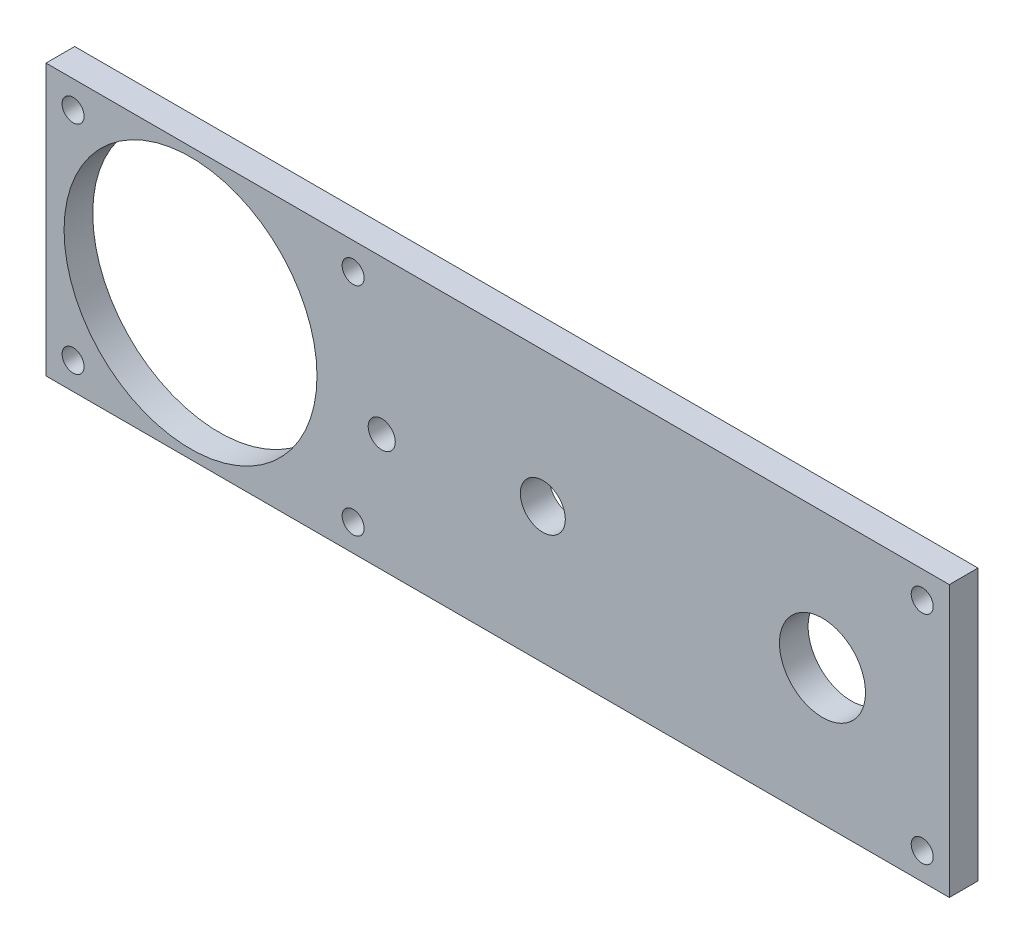
ISO-10303-21;
HEADER;
FILE_DESCRIPTION(('STEP AP214'),'2;1');
FILE_NAME('part.step','',(''),(''),'','','');
FILE_SCHEMA(('AUTOMOTIVE_DESIGN { 1 0 10303 214 1 1 1 1 }'));
ENDSEC;
DATA;
#1=APPLICATION_CONTEXT('core data for automotive mechanical design processes');
#2=APPLICATION_PROTOCOL_DEFINITION('international standard','automotive_design',2000,#1);
#3=PRODUCT_CONTEXT('',#1,'mechanical');
#4=PRODUCT('Part','Part','',(#3));
#5=PRODUCT_RELATED_PRODUCT_CATEGORY('part','',(#4));
#6=PRODUCT_DEFINITION_FORMATION('','',#4);
#7=PRODUCT_DEFINITION_CONTEXT('part definition',#1,'design');
#8=PRODUCT_DEFINITION('design','',#6,#7);
#9=PRODUCT_DEFINITION_SHAPE('','',#8);
#10=(LENGTH_UNIT() NAMED_UNIT(*) SI_UNIT(.MILLI.,.METRE.));
#11=(NAMED_UNIT(*) PLANE_ANGLE_UNIT() SI_UNIT($,.RADIAN.));
#12=(NAMED_UNIT(*) SI_UNIT($,.STERADIAN.) SOLID_ANGLE_UNIT());
#13=UNCERTAINTY_MEASURE_WITH_UNIT(LENGTH_MEASURE(1.E-05),#10,'distance_accuracy_value','');
#14=(GEOMETRIC_REPRESENTATION_CONTEXT(3) GLOBAL_UNCERTAINTY_ASSIGNED_CONTEXT((#13)) GLOBAL_UNIT_ASSIGNED_CONTEXT((#10,
#11,#12)) REPRESENTATION_CONTEXT('',''));
#15=CARTESIAN_POINT('',(0.,0.,0.));
#16=DIRECTION('',(0.,0.,1.));
#17=DIRECTION('',(1.,0.,0.));
#18=AXIS2_PLACEMENT_3D('',#15,#16,#17);
#19=CARTESIAN_POINT('',(0.,0.,3.175));
#20=DIRECTION('',(0.,0.,-1.));
#21=DIRECTION('',(-1.,0.,0.));
#22=AXIS2_PLACEMENT_3D('',#19,#20,#21);
#23=PLANE('',#22);
#24=CARTESIAN_POINT('',(85.9562,15.,3.175));
#25=DIRECTION('',(0.,0.,1.));
#26=DIRECTION('',(1.,0.,0.));
#27=AXIS2_PLACEMENT_3D('',#24,#25,#26);
#28=CIRCLE('',#27,4.7625);
#29=CARTESIAN_POINT('',(90.7187,15.,3.175));
#30=VERTEX_POINT('',#29);
#31=EDGE_CURVE('E165',#30,#30,#28,.T.);
#32=ORIENTED_EDGE('',*,*,#31,.F.);
#33=EDGE_LOOP('',(#32));
#34=FACE_BOUND('',#33,.T.);
#35=CARTESIAN_POINT('',(97.,3.,3.175));
#36=DIRECTION('',(0.,0.,1.));
#37=DIRECTION('',(1.,0.,0.));
#38=AXIS2_PLACEMENT_3D('',#35,#36,#37);
#39=CIRCLE('',#38,1.2192);
#40=CARTESIAN_POINT('',(98.2192,3.,3.175));
#41=VERTEX_POINT('',#40);
#42=EDGE_CURVE('E161',#41,#41,#39,.T.);
#43=ORIENTED_EDGE('',*,*,#42,.F.);
#44=EDGE_LOOP('',(#43));
#45=FACE_BOUND('',#44,.T.);
#46=CARTESIAN_POINT('',(97.,27.,3.175));
#47=DIRECTION('',(0.,0.,1.));
#48=DIRECTION('',(1.,0.,0.));
#49=AXIS2_PLACEMENT_3D('',#46,#47,#48);
#50=CIRCLE('',#49,1.2192);
#51=CARTESIAN_POINT('',(98.2192,27.,3.175));
#52=VERTEX_POINT('',#51);
#53=EDGE_CURVE('E155',#52,#52,#50,.T.);
#54=ORIENTED_EDGE('',*,*,#53,.F.);
#55=EDGE_LOOP('',(#54));
#56=FACE_BOUND('',#55,.T.);
#57=CARTESIAN_POINT('',(3.,27.,3.175));
#58=DIRECTION('',(0.,0.,1.));
#59=DIRECTION('',(1.,0.,0.));
#60=AXIS2_PLACEMENT_3D('',#57,#58,#59);
#61=CIRCLE('',#60,1.2192);
#62=CARTESIAN_POINT('',(4.2192,27.,3.175));
#63=VERTEX_POINT('',#62);
#64=EDGE_CURVE('E149',#63,#63,#61,.T.);
#65=ORIENTED_EDGE('',*,*,#64,.F.);
#66=EDGE_LOOP('',(#65));
#67=FACE_BOUND('',#66,.T.);
#68=CARTESIAN_POINT('',(3.,3.,3.175));
#69=DIRECTION('',(0.,0.,1.));
#70=DIRECTION('',(1.,0.,0.));
#71=AXIS2_PLACEMENT_3D('',#68,#69,#70);
#72=CIRCLE('',#71,1.2192);
#73=CARTESIAN_POINT('',(4.2192,3.,3.175));
#74=VERTEX_POINT('',#73);
#75=EDGE_CURVE('E143',#74,#74,#72,.T.);
#76=ORIENTED_EDGE('',*,*,#75,.F.);
#77=EDGE_LOOP('',(#76));
#78=FACE_BOUND('',#77,.T.);
#79=CARTESIAN_POINT('',(34.,27.,3.175));
#80=DIRECTION('',(0.,0.,1.));
#81=DIRECTION('',(1.,0.,0.));
#82=AXIS2_PLACEMENT_3D('',#79,#80,#81);
#83=CIRCLE('',#82,1.2192);
#84=CARTESIAN_POINT('',(35.2192,27.,3.175));
#85=VERTEX_POINT('',#84);
#86=EDGE_CURVE('E137',#85,#85,#83,.T.);
#87=ORIENTED_EDGE('',*,*,#86,.F.);
#88=EDGE_LOOP('',(#87));
#89=FACE_BOUND('',#88,.T.);
#90=CARTESIAN_POINT('',(34.,3.,3.175));
#91=DIRECTION('',(0.,0.,1.));
#92=DIRECTION('',(1.,0.,0.));
#93=AXIS2_PLACEMENT_3D('',#90,#91,#92);
#94=CIRCLE('',#93,1.2192);
#95=CARTESIAN_POINT('',(35.2192,3.,3.175));
#96=VERTEX_POINT('',#95);
#97=EDGE_CURVE('E131',#96,#96,#94,.T.);
#98=ORIENTED_EDGE('',*,*,#97,.F.);
#99=EDGE_LOOP('',(#98));
#100=FACE_BOUND('',#99,.T.);
#101=CARTESIAN_POINT('',(37.1666992956996,13.,3.175));
#102=DIRECTION('',(0.,0.,1.));
#103=DIRECTION('',(1.,0.,0.));
#104=AXIS2_PLACEMENT_3D('',#101,#102,#103);
#105=CIRCLE('',#104,1.49860000000001);
#106=CARTESIAN_POINT('',(38.6652992956997,13.,3.175));
#107=VERTEX_POINT('',#106);
#108=EDGE_CURVE('E114',#107,#107,#105,.T.);
#109=ORIENTED_EDGE('',*,*,#108,.F.);
#110=EDGE_LOOP('',(#109));
#111=FACE_BOUND('',#110,.T.);
#112=DIRECTION('',(0.,-1.,0.));
#113=VECTOR('',#112,1.);
#114=CARTESIAN_POINT('',(0.,0.,3.175));
#115=LINE('',#114,#113);
#116=CARTESIAN_POINT('',(0.,30.,3.175));
#117=VERTEX_POINT('',#116);
#118=CARTESIAN_POINT('',(0.,0.,3.175));
#119=VERTEX_POINT('',#118);
#120=EDGE_CURVE('E84',#117,#119,#115,.T.);
#121=ORIENTED_EDGE('',*,*,#120,.T.);
#122=DIRECTION('',(1.,0.,0.));
#123=VECTOR('',#122,1.);
#124=CARTESIAN_POINT('',(0.,0.,3.175));
#125=LINE('',#124,#123);
#126=CARTESIAN_POINT('',(100.,0.,3.175));
#127=VERTEX_POINT('',#126);
#128=EDGE_CURVE('E79',#119,#127,#125,.T.);
#129=ORIENTED_EDGE('',*,*,#128,.T.);
#130=DIRECTION('',(0.,1.,0.));
#131=VECTOR('',#130,1.);
#132=CARTESIAN_POINT('',(100.,0.,3.175));
#133=LINE('',#132,#131);
#134=CARTESIAN_POINT('',(100.,30.,3.175));
#135=VERTEX_POINT('',#134);
#136=EDGE_CURVE('E82',#127,#135,#133,.T.);
#137=ORIENTED_EDGE('',*,*,#136,.T.);
#138=DIRECTION('',(-1.,0.,0.));
#139=VECTOR('',#138,1.);
#140=CARTESIAN_POINT('',(0.,30.,3.175));
#141=LINE('',#140,#139);
#142=EDGE_CURVE('E49',#135,#117,#141,.T.);
#143=ORIENTED_EDGE('',*,*,#142,.T.);
#144=EDGE_LOOP('',(#121,#129,#137,#143));
#145=FACE_BOUND('',#144,.T.);
#146=CARTESIAN_POINT('',(55.,15.,3.175));
#147=DIRECTION('',(0.,0.,1.));
#148=DIRECTION('',(1.,0.,0.));
#149=AXIS2_PLACEMENT_3D('',#146,#147,#148);
#150=CIRCLE('',#149,2.4892);
#151=CARTESIAN_POINT('',(57.4892,15.,3.175));
#152=VERTEX_POINT('',#151);
#153=EDGE_CURVE('E99',#152,#152,#150,.T.);
#154=ORIENTED_EDGE('',*,*,#153,.F.);
#155=EDGE_LOOP('',(#154));
#156=FACE_BOUND('',#155,.T.);
#157=CARTESIAN_POINT('',(16.,15.,3.175));
#158=DIRECTION('',(0.,0.,1.));
#159=DIRECTION('',(1.,0.,0.));
#160=AXIS2_PLACEMENT_3D('',#157,#158,#159);
#161=CIRCLE('',#160,14.);
#162=CARTESIAN_POINT('',(30.,15.,3.175));
#163=VERTEX_POINT('',#162);
#164=EDGE_CURVE('E120',#163,#163,#161,.T.);
#165=ORIENTED_EDGE('',*,*,#164,.F.);
#166=EDGE_LOOP('',(#165));
#167=FACE_BOUND('',#166,.T.);
#168=ADVANCED_FACE('F32',(#34,#45,#56,#67,#78,#89,#100,#111,#145,#156,#167),#23,.F.);
#169=CARTESIAN_POINT('',(0.,0.,0.));
#170=DIRECTION('',(0.,0.,-1.));
#171=DIRECTION('',(-1.,0.,0.));
#172=AXIS2_PLACEMENT_3D('',#169,#170,#171);
#173=PLANE('',#172);
#174=CARTESIAN_POINT('',(85.9562,15.,0.));
#175=DIRECTION('',(0.,0.,1.));
#176=DIRECTION('',(1.,0.,0.));
#177=AXIS2_PLACEMENT_3D('',#174,#175,#176);
#178=CIRCLE('',#177,4.7625);
#179=CARTESIAN_POINT('',(90.7187,15.,0.));
#180=VERTEX_POINT('',#179);
#181=EDGE_CURVE('E164',#180,#180,#178,.T.);
#182=ORIENTED_EDGE('',*,*,#181,.T.);
#183=EDGE_LOOP('',(#182));
#184=FACE_BOUND('',#183,.T.);
#185=CARTESIAN_POINT('',(97.,3.,0.));
#186=DIRECTION('',(0.,0.,1.));
#187=DIRECTION('',(1.,0.,0.));
#188=AXIS2_PLACEMENT_3D('',#185,#186,#187);
#189=CIRCLE('',#188,1.2192);
#190=CARTESIAN_POINT('',(98.2192,3.,0.));
#191=VERTEX_POINT('',#190);
#192=EDGE_CURVE('E158',#191,#191,#189,.T.);
#193=ORIENTED_EDGE('',*,*,#192,.T.);
#194=EDGE_LOOP('',(#193));
#195=FACE_BOUND('',#194,.T.);
#196=CARTESIAN_POINT('',(97.,27.,0.));
#197=DIRECTION('',(0.,0.,1.));
#198=DIRECTION('',(1.,0.,0.));
#199=AXIS2_PLACEMENT_3D('',#196,#197,#198);
#200=CIRCLE('',#199,1.2192);
#201=CARTESIAN_POINT('',(98.2192,27.,0.));
#202=VERTEX_POINT('',#201);
#203=EDGE_CURVE('E152',#202,#202,#200,.T.);
#204=ORIENTED_EDGE('',*,*,#203,.T.);
#205=EDGE_LOOP('',(#204));
#206=FACE_BOUND('',#205,.T.);
#207=CARTESIAN_POINT('',(3.,27.,0.));
#208=DIRECTION('',(0.,0.,1.));
#209=DIRECTION('',(1.,0.,0.));
#210=AXIS2_PLACEMENT_3D('',#207,#208,#209);
#211=CIRCLE('',#210,1.2192);
#212=CARTESIAN_POINT('',(4.2192,27.,0.));
#213=VERTEX_POINT('',#212);
#214=EDGE_CURVE('E146',#213,#213,#211,.T.);
#215=ORIENTED_EDGE('',*,*,#214,.T.);
#216=EDGE_LOOP('',(#215));
#217=FACE_BOUND('',#216,.T.);
#218=CARTESIAN_POINT('',(3.,3.,0.));
#219=DIRECTION('',(0.,0.,1.));
#220=DIRECTION('',(1.,0.,0.));
#221=AXIS2_PLACEMENT_3D('',#218,#219,#220);
#222=CIRCLE('',#221,1.2192);
#223=CARTESIAN_POINT('',(4.2192,3.,0.));
#224=VERTEX_POINT('',#223);
#225=EDGE_CURVE('E140',#224,#224,#222,.T.);
#226=ORIENTED_EDGE('',*,*,#225,.T.);
#227=EDGE_LOOP('',(#226));
#228=FACE_BOUND('',#227,.T.);
#229=CARTESIAN_POINT('',(34.,27.,0.));
#230=DIRECTION('',(0.,0.,1.));
#231=DIRECTION('',(1.,0.,0.));
#232=AXIS2_PLACEMENT_3D('',#229,#230,#231);
#233=CIRCLE('',#232,1.2192);
#234=CARTESIAN_POINT('',(35.2192,27.,0.));
#235=VERTEX_POINT('',#234);
#236=EDGE_CURVE('E134',#235,#235,#233,.T.);
#237=ORIENTED_EDGE('',*,*,#236,.T.);
#238=EDGE_LOOP('',(#237));
#239=FACE_BOUND('',#238,.T.);
#240=CARTESIAN_POINT('',(34.,3.,0.));
#241=DIRECTION('',(0.,0.,1.));
#242=DIRECTION('',(1.,0.,0.));
#243=AXIS2_PLACEMENT_3D('',#240,#241,#242);
#244=CIRCLE('',#243,1.2192);
#245=CARTESIAN_POINT('',(35.2192,3.,0.));
#246=VERTEX_POINT('',#245);
#247=EDGE_CURVE('E126',#246,#246,#244,.T.);
#248=ORIENTED_EDGE('',*,*,#247,.T.);
#249=EDGE_LOOP('',(#248));
#250=FACE_BOUND('',#249,.T.);
#251=CARTESIAN_POINT('',(37.1666992956996,13.,0.));
#252=DIRECTION('',(0.,0.,1.));
#253=DIRECTION('',(1.,0.,0.));
#254=AXIS2_PLACEMENT_3D('',#251,#252,#253);
#255=CIRCLE('',#254,1.49860000000001);
#256=CARTESIAN_POINT('',(38.6652992956997,13.,0.));
#257=VERTEX_POINT('',#256);
#258=EDGE_CURVE('E117',#257,#257,#255,.T.);
#259=ORIENTED_EDGE('',*,*,#258,.T.);
#260=EDGE_LOOP('',(#259));
#261=FACE_BOUND('',#260,.T.);
#262=DIRECTION('',(0.,-1.,0.));
#263=VECTOR('',#262,1.);
#264=CARTESIAN_POINT('',(0.,0.,0.));
#265=LINE('',#264,#263);
#266=CARTESIAN_POINT('',(0.,30.,0.));
#267=VERTEX_POINT('',#266);
#268=CARTESIAN_POINT('',(0.,0.,0.));
#269=VERTEX_POINT('',#268);
#270=EDGE_CURVE('E96',#267,#269,#265,.T.);
#271=ORIENTED_EDGE('',*,*,#270,.F.);
#272=DIRECTION('',(-1.,0.,0.));
#273=VECTOR('',#272,1.);
#274=CARTESIAN_POINT('',(0.,30.,0.));
#275=LINE('',#274,#273);
#276=CARTESIAN_POINT('',(100.,30.,0.));
#277=VERTEX_POINT('',#276);
#278=EDGE_CURVE('E72',#277,#267,#275,.T.);
#279=ORIENTED_EDGE('',*,*,#278,.F.);
#280=DIRECTION('',(0.,1.,0.));
#281=VECTOR('',#280,1.);
#282=CARTESIAN_POINT('',(100.,0.,0.));
#283=LINE('',#282,#281);
#284=CARTESIAN_POINT('',(100.,0.,0.));
#285=VERTEX_POINT('',#284);
#286=EDGE_CURVE('E66',#285,#277,#283,.T.);
#287=ORIENTED_EDGE('',*,*,#286,.F.);
#288=DIRECTION('',(1.,0.,0.));
#289=VECTOR('',#288,1.);
#290=CARTESIAN_POINT('',(0.,0.,0.));
#291=LINE('',#290,#289);
#292=EDGE_CURVE('E88',#269,#285,#291,.T.);
#293=ORIENTED_EDGE('',*,*,#292,.F.);
#294=EDGE_LOOP('',(#271,#279,#287,#293));
#295=FACE_BOUND('',#294,.T.);
#296=CARTESIAN_POINT('',(55.,15.,0.));
#297=DIRECTION('',(0.,0.,1.));
#298=DIRECTION('',(1.,0.,0.));
#299=AXIS2_PLACEMENT_3D('',#296,#297,#298);
#300=CIRCLE('',#299,2.4892);
#301=CARTESIAN_POINT('',(57.4892,15.,0.));
#302=VERTEX_POINT('',#301);
#303=EDGE_CURVE('E111',#302,#302,#300,.T.);
#304=ORIENTED_EDGE('',*,*,#303,.T.);
#305=EDGE_LOOP('',(#304));
#306=FACE_BOUND('',#305,.T.);
#307=CARTESIAN_POINT('',(16.,15.,0.));
#308=DIRECTION('',(0.,0.,1.));
#309=DIRECTION('',(1.,0.,0.));
#310=AXIS2_PLACEMENT_3D('',#307,#308,#309);
#311=CIRCLE('',#310,14.);
#312=CARTESIAN_POINT('',(30.,15.,0.));
#313=VERTEX_POINT('',#312);
#314=EDGE_CURVE('E123',#313,#313,#311,.T.);
#315=ORIENTED_EDGE('',*,*,#314,.T.);
#316=EDGE_LOOP('',(#315));
#317=FACE_BOUND('',#316,.T.);
#318=ADVANCED_FACE('F107',(#184,#195,#206,#217,#228,#239,#250,#261,#295,#306,#317),#173,.T.);
#319=CARTESIAN_POINT('',(0.,0.,3.175));
#320=DIRECTION('',(1.,0.,0.));
#321=DIRECTION('',(0.,0.,-1.));
#322=AXIS2_PLACEMENT_3D('',#319,#320,#321);
#323=PLANE('',#322);
#324=ORIENTED_EDGE('',*,*,#270,.T.);
#325=DIRECTION('',(0.,0.,-1.));
#326=VECTOR('',#325,1.);
#327=CARTESIAN_POINT('',(0.,0.,3.175));
#328=LINE('',#327,#326);
#329=EDGE_CURVE('E11',#119,#269,#328,.T.);
#330=ORIENTED_EDGE('',*,*,#329,.F.);
#331=ORIENTED_EDGE('',*,*,#120,.F.);
#332=DIRECTION('',(0.,0.,-1.));
#333=VECTOR('',#332,1.);
#334=CARTESIAN_POINT('',(0.,30.,3.175));
#335=LINE('',#334,#333);
#336=EDGE_CURVE('E92',#117,#267,#335,.T.);
#337=ORIENTED_EDGE('',*,*,#336,.T.);
#338=EDGE_LOOP('',(#324,#330,#331,#337));
#339=FACE_BOUND('',#338,.T.);
#340=ADVANCED_FACE('F34',(#339),#323,.F.);
#341=CARTESIAN_POINT('',(0.,0.,3.175));
#342=DIRECTION('',(0.,1.,0.));
#343=DIRECTION('',(-1.,0.,0.));
#344=AXIS2_PLACEMENT_3D('',#341,#342,#343);
#345=PLANE('',#344);
#346=ORIENTED_EDGE('',*,*,#292,.T.);
#347=DIRECTION('',(0.,0.,-1.));
#348=VECTOR('',#347,1.);
#349=CARTESIAN_POINT('',(100.,0.,3.175));
#350=LINE('',#349,#348);
#351=EDGE_CURVE('E41',#127,#285,#350,.T.);
#352=ORIENTED_EDGE('',*,*,#351,.F.);
#353=ORIENTED_EDGE('',*,*,#128,.F.);
#354=ORIENTED_EDGE('',*,*,#329,.T.);
#355=EDGE_LOOP('',(#346,#352,#353,#354));
#356=FACE_BOUND('',#355,.T.);
#357=ADVANCED_FACE('F87',(#356),#345,.F.);
#358=CARTESIAN_POINT('',(100.,0.,3.175));
#359=DIRECTION('',(-1.,0.,0.));
#360=DIRECTION('',(0.,0.,1.));
#361=AXIS2_PLACEMENT_3D('',#358,#359,#360);
#362=PLANE('',#361);
#363=ORIENTED_EDGE('',*,*,#286,.T.);
#364=DIRECTION('',(0.,0.,-1.));
#365=VECTOR('',#364,1.);
#366=CARTESIAN_POINT('',(100.,30.,3.175));
#367=LINE('',#366,#365);
#368=EDGE_CURVE('E89',#135,#277,#367,.T.);
#369=ORIENTED_EDGE('',*,*,#368,.F.);
#370=ORIENTED_EDGE('',*,*,#136,.F.);
#371=ORIENTED_EDGE('',*,*,#351,.T.);
#372=EDGE_LOOP('',(#363,#369,#370,#371));
#373=FACE_BOUND('',#372,.T.);
#374=ADVANCED_FACE('F90',(#373),#362,.F.);
#375=CARTESIAN_POINT('',(0.,30.,3.175));
#376=DIRECTION('',(0.,-1.,0.));
#377=DIRECTION('',(1.,0.,0.));
#378=AXIS2_PLACEMENT_3D('',#375,#376,#377);
#379=PLANE('',#378);
#380=ORIENTED_EDGE('',*,*,#278,.T.);
#381=ORIENTED_EDGE('',*,*,#336,.F.);
#382=ORIENTED_EDGE('',*,*,#142,.F.);
#383=ORIENTED_EDGE('',*,*,#368,.T.);
#384=EDGE_LOOP('',(#380,#381,#382,#383));
#385=FACE_BOUND('',#384,.T.);
#386=ADVANCED_FACE('F104',(#385),#379,.F.);
#387=CARTESIAN_POINT('',(55.,15.,3.175));
#388=DIRECTION('',(0.,0.,-1.));
#389=DIRECTION('',(-1.,0.,0.));
#390=AXIS2_PLACEMENT_3D('',#387,#388,#389);
#391=CYLINDRICAL_SURFACE('',#390,2.4892);
#392=ORIENTED_EDGE('',*,*,#153,.T.);
#393=EDGE_LOOP('',(#392));
#394=FACE_BOUND('',#393,.T.);
#395=ORIENTED_EDGE('',*,*,#303,.F.);
#396=EDGE_LOOP('',(#395));
#397=FACE_BOUND('',#396,.T.);
#398=ADVANCED_FACE('F201',(#394,#397),#391,.F.);
#399=CARTESIAN_POINT('',(37.1666992956996,13.,3.175));
#400=DIRECTION('',(0.,0.,-1.));
#401=DIRECTION('',(-1.,0.,0.));
#402=AXIS2_PLACEMENT_3D('',#399,#400,#401);
#403=CYLINDRICAL_SURFACE('',#402,1.49860000000001);
#404=ORIENTED_EDGE('',*,*,#108,.T.);
#405=EDGE_LOOP('',(#404));
#406=FACE_BOUND('',#405,.T.);
#407=ORIENTED_EDGE('',*,*,#258,.F.);
#408=EDGE_LOOP('',(#407));
#409=FACE_BOUND('',#408,.T.);
#410=ADVANCED_FACE('F197',(#406,#409),#403,.F.);
#411=CARTESIAN_POINT('',(16.,15.,3.175));
#412=DIRECTION('',(0.,0.,-1.));
#413=DIRECTION('',(-1.,0.,0.));
#414=AXIS2_PLACEMENT_3D('',#411,#412,#413);
#415=CYLINDRICAL_SURFACE('',#414,14.);
#416=ORIENTED_EDGE('',*,*,#164,.T.);
#417=EDGE_LOOP('',(#416));
#418=FACE_BOUND('',#417,.T.);
#419=ORIENTED_EDGE('',*,*,#314,.F.);
#420=EDGE_LOOP('',(#419));
#421=FACE_BOUND('',#420,.T.);
#422=ADVANCED_FACE('F200',(#418,#421),#415,.F.);
#423=CARTESIAN_POINT('',(34.,3.,3.175));
#424=DIRECTION('',(0.,0.,1.));
#425=DIRECTION('',(1.,0.,0.));
#426=AXIS2_PLACEMENT_3D('',#423,#424,#425);
#427=CYLINDRICAL_SURFACE('',#426,1.2192);
#428=ORIENTED_EDGE('',*,*,#247,.F.);
#429=EDGE_LOOP('',(#428));
#430=FACE_BOUND('',#429,.T.);
#431=ORIENTED_EDGE('',*,*,#97,.T.);
#432=EDGE_LOOP('',(#431));
#433=FACE_BOUND('',#432,.T.);
#434=ADVANCED_FACE('F244',(#430,#433),#427,.F.);
#435=CARTESIAN_POINT('',(34.,27.,3.175));
#436=DIRECTION('',(0.,0.,1.));
#437=DIRECTION('',(1.,0.,0.));
#438=AXIS2_PLACEMENT_3D('',#435,#436,#437);
#439=CYLINDRICAL_SURFACE('',#438,1.2192);
#440=ORIENTED_EDGE('',*,*,#236,.F.);
#441=EDGE_LOOP('',(#440));
#442=FACE_BOUND('',#441,.T.);
#443=ORIENTED_EDGE('',*,*,#86,.T.);
#444=EDGE_LOOP('',(#443));
#445=FACE_BOUND('',#444,.T.);
#446=ADVANCED_FACE('F252',(#442,#445),#439,.F.);
#447=CARTESIAN_POINT('',(3.,3.,3.175));
#448=DIRECTION('',(0.,0.,1.));
#449=DIRECTION('',(1.,0.,0.));
#450=AXIS2_PLACEMENT_3D('',#447,#448,#449);
#451=CYLINDRICAL_SURFACE('',#450,1.2192);
#452=ORIENTED_EDGE('',*,*,#225,.F.);
#453=EDGE_LOOP('',(#452));
#454=FACE_BOUND('',#453,.T.);
#455=ORIENTED_EDGE('',*,*,#75,.T.);
#456=EDGE_LOOP('',(#455));
#457=FACE_BOUND('',#456,.T.);
#458=ADVANCED_FACE('F260',(#454,#457),#451,.F.);
#459=CARTESIAN_POINT('',(3.,27.,3.175));
#460=DIRECTION('',(0.,0.,1.));
#461=DIRECTION('',(1.,0.,0.));
#462=AXIS2_PLACEMENT_3D('',#459,#460,#461);
#463=CYLINDRICAL_SURFACE('',#462,1.2192);
#464=ORIENTED_EDGE('',*,*,#214,.F.);
#465=EDGE_LOOP('',(#464));
#466=FACE_BOUND('',#465,.T.);
#467=ORIENTED_EDGE('',*,*,#64,.T.);
#468=EDGE_LOOP('',(#467));
#469=FACE_BOUND('',#468,.T.);
#470=ADVANCED_FACE('F268',(#466,#469),#463,.F.);
#471=CARTESIAN_POINT('',(97.,27.,3.175));
#472=DIRECTION('',(0.,0.,1.));
#473=DIRECTION('',(1.,0.,0.));
#474=AXIS2_PLACEMENT_3D('',#471,#472,#473);
#475=CYLINDRICAL_SURFACE('',#474,1.2192);
#476=ORIENTED_EDGE('',*,*,#203,.F.);
#477=EDGE_LOOP('',(#476));
#478=FACE_BOUND('',#477,.T.);
#479=ORIENTED_EDGE('',*,*,#53,.T.);
#480=EDGE_LOOP('',(#479));
#481=FACE_BOUND('',#480,.T.);
#482=ADVANCED_FACE('F276',(#478,#481),#475,.F.);
#483=CARTESIAN_POINT('',(97.,3.,3.175));
#484=DIRECTION('',(0.,0.,1.));
#485=DIRECTION('',(1.,0.,0.));
#486=AXIS2_PLACEMENT_3D('',#483,#484,#485);
#487=CYLINDRICAL_SURFACE('',#486,1.2192);
#488=ORIENTED_EDGE('',*,*,#192,.F.);
#489=EDGE_LOOP('',(#488));
#490=FACE_BOUND('',#489,.T.);
#491=ORIENTED_EDGE('',*,*,#42,.T.);
#492=EDGE_LOOP('',(#491));
#493=FACE_BOUND('',#492,.T.);
#494=ADVANCED_FACE('F176',(#490,#493),#487,.F.);
#495=CARTESIAN_POINT('',(85.9562,15.,0.));
#496=DIRECTION('',(0.,0.,1.));
#497=DIRECTION('',(1.,0.,0.));
#498=AXIS2_PLACEMENT_3D('',#495,#496,#497);
#499=CYLINDRICAL_SURFACE('',#498,4.7625);
#500=ORIENTED_EDGE('',*,*,#181,.F.);
#501=EDGE_LOOP('',(#500));
#502=FACE_BOUND('',#501,.T.);
#503=ORIENTED_EDGE('',*,*,#31,.T.);
#504=EDGE_LOOP('',(#503));
#505=FACE_BOUND('',#504,.T.);
#506=ADVANCED_FACE('F173',(#502,#505),#499,.F.);
#507=CLOSED_SHELL('',(#168,#318,#340,#357,#374,#386,#398,#410,#422,#434,#446,#458,#470,#482,
#494,#506));
#508=MANIFOLD_SOLID_BREP('B2',#507);
#509=ADVANCED_BREP_SHAPE_REPRESENTATION('',(#18,#508),#14);
#510=SHAPE_DEFINITION_REPRESENTATION(#9,#509);
ENDSEC;
END-ISO-10303-21;
